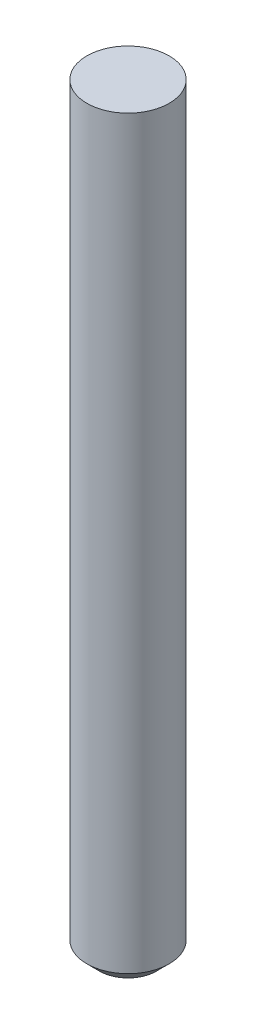
ISO-10303-21;
HEADER;
FILE_DESCRIPTION(('STEP AP214'),'2;1');
FILE_NAME('part.step','',(''),(''),'','','');
FILE_SCHEMA(('AUTOMOTIVE_DESIGN { 1 0 10303 214 1 1 1 1 }'));
ENDSEC;
DATA;
#1=APPLICATION_CONTEXT('core data for automotive mechanical design processes');
#2=APPLICATION_PROTOCOL_DEFINITION('international standard','automotive_design',2000,#1);
#3=PRODUCT_CONTEXT('',#1,'mechanical');
#4=PRODUCT('Part','Part','',(#3));
#5=PRODUCT_RELATED_PRODUCT_CATEGORY('part','',(#4));
#6=PRODUCT_DEFINITION_FORMATION('','',#4);
#7=PRODUCT_DEFINITION_CONTEXT('part definition',#1,'design');
#8=PRODUCT_DEFINITION('design','',#6,#7);
#9=PRODUCT_DEFINITION_SHAPE('','',#8);
#10=(LENGTH_UNIT() NAMED_UNIT(*) SI_UNIT(.MILLI.,.METRE.));
#11=(NAMED_UNIT(*) PLANE_ANGLE_UNIT() SI_UNIT($,.RADIAN.));
#12=(NAMED_UNIT(*) SI_UNIT($,.STERADIAN.) SOLID_ANGLE_UNIT());
#13=UNCERTAINTY_MEASURE_WITH_UNIT(LENGTH_MEASURE(1.E-05),#10,'distance_accuracy_value','');
#14=(GEOMETRIC_REPRESENTATION_CONTEXT(3) GLOBAL_UNCERTAINTY_ASSIGNED_CONTEXT((#13)) GLOBAL_UNIT_ASSIGNED_CONTEXT((#10,
#11,#12)) REPRESENTATION_CONTEXT('',''));
#15=CARTESIAN_POINT('',(0.,0.,0.));
#16=DIRECTION('',(0.,0.,1.));
#17=DIRECTION('',(1.,0.,0.));
#18=AXIS2_PLACEMENT_3D('',#15,#16,#17);
#19=CARTESIAN_POINT('',(0.,-15.12,-31.8));
#20=DIRECTION('',(0.,1.,0.));
#21=DIRECTION('',(0.,0.,1.));
#22=AXIS2_PLACEMENT_3D('',#19,#20,#21);
#23=CONICAL_SURFACE('',#22,0.55,0.7853981634);
#24=CARTESIAN_POINT('',(0.,-15.02,-31.8));
#25=DIRECTION('',(0.,-1.,0.));
#26=DIRECTION('',(0.,0.,1.));
#27=AXIS2_PLACEMENT_3D('',#24,#25,#26);
#28=CIRCLE('',#27,0.65);
#29=CARTESIAN_POINT('',(0.,-15.02,-32.45));
#30=VERTEX_POINT('',#29);
#31=EDGE_CURVE('E11',#30,#30,#28,.T.);
#32=ORIENTED_EDGE('',*,*,#31,.T.);
#33=CARTESIAN_POINT('',(0.,-15.22,-32.25));
#34=CARTESIAN_POINT('',(0.,-15.02,-32.45));
#35=B_SPLINE_CURVE_WITH_KNOTS('',1,(#33,#34),.UNSPECIFIED.,.F.,.F.,(2,2),(-0.141421356237311,
0.141421356237311),.UNSPECIFIED.);
#36=CARTESIAN_POINT('',(0.,-15.22,-32.25));
#37=VERTEX_POINT('',#36);
#38=EDGE_CURVE('E24',#37,#30,#35,.T.);
#39=ORIENTED_EDGE('',*,*,#38,.F.);
#40=CARTESIAN_POINT('',(0.,-15.22,-31.8));
#41=DIRECTION('',(0.,1.,0.));
#42=DIRECTION('',(0.,0.,1.));
#43=AXIS2_PLACEMENT_3D('',#40,#41,#42);
#44=CIRCLE('',#43,0.45);
#45=EDGE_CURVE('E42',#37,#37,#44,.T.);
#46=ORIENTED_EDGE('',*,*,#45,.T.);
#47=ORIENTED_EDGE('',*,*,#38,.T.);
#48=EDGE_LOOP('',(#32,#39,#46,#47));
#49=FACE_BOUND('',#48,.T.);
#50=ADVANCED_FACE('F17',(#49),#23,.T.);
#51=CARTESIAN_POINT('',(0.,-15.22,-31.8));
#52=DIRECTION('',(0.,-1.,0.));
#53=DIRECTION('',(0.,0.,-1.));
#54=AXIS2_PLACEMENT_3D('',#51,#52,#53);
#55=PLANE('',#54);
#56=ORIENTED_EDGE('',*,*,#45,.F.);
#57=EDGE_LOOP('',(#56));
#58=FACE_BOUND('',#57,.T.);
#59=ADVANCED_FACE('F55',(#58),#55,.T.);
#60=CARTESIAN_POINT('',(0.,-2.65,-31.8));
#61=DIRECTION('',(0.,-1.,0.));
#62=DIRECTION('',(0.,0.,-1.));
#63=AXIS2_PLACEMENT_3D('',#60,#61,#62);
#64=CYLINDRICAL_SURFACE('',#63,0.65);
#65=CARTESIAN_POINT('',(0.,-3.25,-31.8));
#66=DIRECTION('',(0.,-1.,0.));
#67=DIRECTION('',(0.,0.,-1.));
#68=AXIS2_PLACEMENT_3D('',#65,#66,#67);
#69=CIRCLE('',#68,0.65);
#70=CARTESIAN_POINT('',(0.,-3.25,-32.45));
#71=VERTEX_POINT('',#70);
#72=EDGE_CURVE('E38',#71,#71,#69,.T.);
#73=ORIENTED_EDGE('',*,*,#72,.T.);
#74=CARTESIAN_POINT('',(0.,-3.25,-32.45));
#75=CARTESIAN_POINT('',(0.,-15.02,-32.45));
#76=B_SPLINE_CURVE_WITH_KNOTS('',1,(#74,#75),.UNSPECIFIED.,.F.,.F.,(2,2),(0.6,12.37),.UNSPECIFIED.);
#77=EDGE_CURVE('E40',#71,#30,#76,.T.);
#78=ORIENTED_EDGE('',*,*,#77,.T.);
#79=ORIENTED_EDGE('',*,*,#31,.F.);
#80=ORIENTED_EDGE('',*,*,#77,.F.);
#81=EDGE_LOOP('',(#73,#78,#79,#80));
#82=FACE_BOUND('',#81,.T.);
#83=ADVANCED_FACE('F39',(#82),#64,.T.);
#84=CARTESIAN_POINT('',(24.43110368616,-3.25,-31.113111927679));
#85=DIRECTION('',(0.,1.,0.));
#86=DIRECTION('',(0.,0.,-1.));
#87=AXIS2_PLACEMENT_3D('',#84,#85,#86);
#88=PLANE('',#87);
#89=ORIENTED_EDGE('',*,*,#72,.F.);
#90=EDGE_LOOP('',(#89));
#91=FACE_BOUND('',#90,.T.);
#92=ADVANCED_FACE('F62',(#91),#88,.T.);
#93=CLOSED_SHELL('',(#50,#59,#83,#92));
#94=MANIFOLD_SOLID_BREP('B1',#93);
#95=ADVANCED_BREP_SHAPE_REPRESENTATION('',(#18,#94),#14);
#96=SHAPE_DEFINITION_REPRESENTATION(#9,#95);
ENDSEC;
END-ISO-10303-21;
